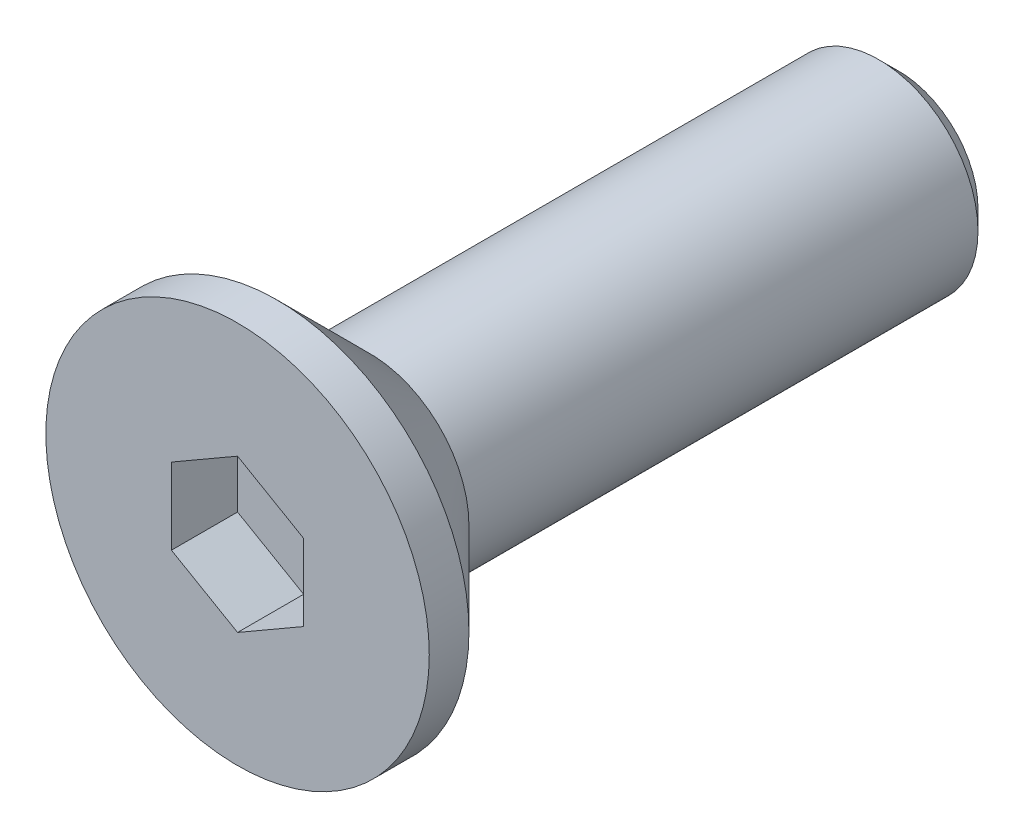
ISO-10303-21;
HEADER;
FILE_DESCRIPTION(('STEP AP214'),'2;1');
FILE_NAME('part.step','',(''),(''),'','','');
FILE_SCHEMA(('AUTOMOTIVE_DESIGN { 1 0 10303 214 1 1 1 1 }'));
ENDSEC;
DATA;
#1=APPLICATION_CONTEXT('core data for automotive mechanical design processes');
#2=APPLICATION_PROTOCOL_DEFINITION('international standard','automotive_design',2000,#1);
#3=PRODUCT_CONTEXT('',#1,'mechanical');
#4=PRODUCT('Part','Part','',(#3));
#5=PRODUCT_RELATED_PRODUCT_CATEGORY('part','',(#4));
#6=PRODUCT_DEFINITION_FORMATION('','',#4);
#7=PRODUCT_DEFINITION_CONTEXT('part definition',#1,'design');
#8=PRODUCT_DEFINITION('design','',#6,#7);
#9=PRODUCT_DEFINITION_SHAPE('','',#8);
#10=(LENGTH_UNIT() NAMED_UNIT(*) SI_UNIT(.MILLI.,.METRE.));
#11=(NAMED_UNIT(*) PLANE_ANGLE_UNIT() SI_UNIT($,.RADIAN.));
#12=(NAMED_UNIT(*) SI_UNIT($,.STERADIAN.) SOLID_ANGLE_UNIT());
#13=UNCERTAINTY_MEASURE_WITH_UNIT(LENGTH_MEASURE(1.E-05),#10,'distance_accuracy_value','');
#14=(GEOMETRIC_REPRESENTATION_CONTEXT(3) GLOBAL_UNCERTAINTY_ASSIGNED_CONTEXT((#13)) GLOBAL_UNIT_ASSIGNED_CONTEXT((#10,
#11,#12)) REPRESENTATION_CONTEXT('',''));
#15=CARTESIAN_POINT('',(0.,0.,0.));
#16=DIRECTION('',(0.,0.,1.));
#17=DIRECTION('',(1.,0.,0.));
#18=AXIS2_PLACEMENT_3D('',#15,#16,#17);
#19=CARTESIAN_POINT('',(0.,0.,0.));
#20=DIRECTION('',(0.,0.,-1.));
#21=DIRECTION('',(-1.,0.,0.));
#22=AXIS2_PLACEMENT_3D('',#19,#20,#21);
#23=PLANE('',#22);
#24=DIRECTION('',(0.,1.,0.));
#25=VECTOR('',#24,1.);
#26=CARTESIAN_POINT('',(1.,-0.577350269189626,0.));
#27=LINE('',#26,#25);
#28=CARTESIAN_POINT('',(1.,-0.577350269189626,0.));
#29=VERTEX_POINT('',#28);
#30=CARTESIAN_POINT('',(1.,0.577350269189626,0.));
#31=VERTEX_POINT('',#30);
#32=EDGE_CURVE('E126',#29,#31,#27,.T.);
#33=ORIENTED_EDGE('',*,*,#32,.F.);
#34=DIRECTION('',(0.866025403784439,0.5,0.));
#35=VECTOR('',#34,1.);
#36=CARTESIAN_POINT('',(0.,-1.15470053837925,0.));
#37=LINE('',#36,#35);
#38=CARTESIAN_POINT('',(0.,-1.15470053837925,0.));
#39=VERTEX_POINT('',#38);
#40=EDGE_CURVE('E52',#39,#29,#37,.T.);
#41=ORIENTED_EDGE('',*,*,#40,.F.);
#42=DIRECTION('',(0.866025403784439,-0.5,0.));
#43=VECTOR('',#42,1.);
#44=CARTESIAN_POINT('',(-1.,-0.577350269189626,0.));
#45=LINE('',#44,#43);
#46=CARTESIAN_POINT('',(-1.,-0.577350269189626,0.));
#47=VERTEX_POINT('',#46);
#48=EDGE_CURVE('E135',#47,#39,#45,.T.);
#49=ORIENTED_EDGE('',*,*,#48,.F.);
#50=DIRECTION('',(0.,-1.,0.));
#51=VECTOR('',#50,1.);
#52=CARTESIAN_POINT('',(-1.,0.577350269189626,0.));
#53=LINE('',#52,#51);
#54=CARTESIAN_POINT('',(-1.,0.577350269189626,0.));
#55=VERTEX_POINT('',#54);
#56=EDGE_CURVE('E133',#55,#47,#53,.T.);
#57=ORIENTED_EDGE('',*,*,#56,.F.);
#58=DIRECTION('',(-0.866025403784439,-0.5,0.));
#59=VECTOR('',#58,1.);
#60=CARTESIAN_POINT('',(0.,1.15470053837925,0.));
#61=LINE('',#60,#59);
#62=CARTESIAN_POINT('',(0.,1.15470053837925,0.));
#63=VERTEX_POINT('',#62);
#64=EDGE_CURVE('E100',#63,#55,#61,.T.);
#65=ORIENTED_EDGE('',*,*,#64,.F.);
#66=DIRECTION('',(-0.866025403784439,0.5,0.));
#67=VECTOR('',#66,1.);
#68=CARTESIAN_POINT('',(1.,0.577350269189626,0.));
#69=LINE('',#68,#67);
#70=EDGE_CURVE('E129',#31,#63,#69,.T.);
#71=ORIENTED_EDGE('',*,*,#70,.F.);
#72=EDGE_LOOP('',(#33,#41,#49,#57,#65,#71));
#73=FACE_BOUND('',#72,.T.);
#74=CARTESIAN_POINT('',(0.,0.,0.));
#75=DIRECTION('',(0.,0.,1.));
#76=DIRECTION('',(1.,0.,0.));
#77=AXIS2_PLACEMENT_3D('',#74,#75,#76);
#78=CIRCLE('',#77,2.9);
#79=CARTESIAN_POINT('',(2.9,0.,0.));
#80=VERTEX_POINT('',#79);
#81=EDGE_CURVE('E150',#80,#80,#78,.T.);
#82=ORIENTED_EDGE('',*,*,#81,.T.);
#83=EDGE_LOOP('',(#82));
#84=FACE_BOUND('',#83,.T.);
#85=ADVANCED_FACE('F37',(#73,#84),#23,.F.);
#86=CARTESIAN_POINT('',(0.,0.,31.7635815070186));
#87=DIRECTION('',(0.,0.,1.));
#88=DIRECTION('',(1.,0.,0.));
#89=AXIS2_PLACEMENT_3D('',#86,#87,#88);
#90=CYLINDRICAL_SURFACE('',#89,2.9);
#91=ORIENTED_EDGE('',*,*,#81,.F.);
#92=EDGE_LOOP('',(#91));
#93=FACE_BOUND('',#92,.T.);
#94=CARTESIAN_POINT('',(0.,0.,-0.60000000000001));
#95=DIRECTION('',(0.,0.,1.));
#96=DIRECTION('',(1.,0.,0.));
#97=AXIS2_PLACEMENT_3D('',#94,#95,#96);
#98=CIRCLE('',#97,2.9);
#99=CARTESIAN_POINT('',(2.9,0.,-0.60000000000001));
#100=VERTEX_POINT('',#99);
#101=EDGE_CURVE('E147',#100,#100,#98,.T.);
#102=ORIENTED_EDGE('',*,*,#101,.T.);
#103=EDGE_LOOP('',(#102));
#104=FACE_BOUND('',#103,.T.);
#105=ADVANCED_FACE('F167',(#93,#104),#90,.T.);
#106=CARTESIAN_POINT('',(0.,0.,-2.));
#107=DIRECTION('',(0.,0.,1.));
#108=DIRECTION('',(1.,0.,0.));
#109=AXIS2_PLACEMENT_3D('',#106,#107,#108);
#110=CONICAL_SURFACE('',#109,1.5,0.785398163397451);
#111=ORIENTED_EDGE('',*,*,#101,.F.);
#112=EDGE_LOOP('',(#111));
#113=FACE_BOUND('',#112,.T.);
#114=CARTESIAN_POINT('',(0.,0.,-2.));
#115=DIRECTION('',(0.,0.,1.));
#116=DIRECTION('',(1.,0.,0.));
#117=AXIS2_PLACEMENT_3D('',#114,#115,#116);
#118=CIRCLE('',#117,1.5);
#119=CARTESIAN_POINT('',(1.5,0.,-2.));
#120=VERTEX_POINT('',#119);
#121=EDGE_CURVE('E139',#120,#120,#118,.T.);
#122=ORIENTED_EDGE('',*,*,#121,.T.);
#123=EDGE_LOOP('',(#122));
#124=FACE_BOUND('',#123,.T.);
#125=ADVANCED_FACE('F172',(#113,#124),#110,.T.);
#126=CARTESIAN_POINT('',(0.,0.,31.7635815070186));
#127=DIRECTION('',(0.,0.,1.));
#128=DIRECTION('',(1.,0.,0.));
#129=AXIS2_PLACEMENT_3D('',#126,#127,#128);
#130=CYLINDRICAL_SURFACE('',#129,1.5);
#131=CARTESIAN_POINT('',(0.,0.,-9.7));
#132=DIRECTION('',(0.,0.,1.));
#133=DIRECTION('',(1.,0.,0.));
#134=AXIS2_PLACEMENT_3D('',#131,#132,#133);
#135=CIRCLE('',#134,1.5);
#136=CARTESIAN_POINT('',(1.5,0.,-9.7));
#137=VERTEX_POINT('',#136);
#138=EDGE_CURVE('E45',#137,#137,#135,.T.);
#139=ORIENTED_EDGE('',*,*,#138,.T.);
#140=EDGE_LOOP('',(#139));
#141=FACE_BOUND('',#140,.T.);
#142=ORIENTED_EDGE('',*,*,#121,.F.);
#143=EDGE_LOOP('',(#142));
#144=FACE_BOUND('',#143,.T.);
#145=ADVANCED_FACE('F155',(#141,#144),#130,.T.);
#146=CARTESIAN_POINT('',(0.,1.5,-10.));
#147=DIRECTION('',(0.,0.,1.));
#148=DIRECTION('',(1.,0.,0.));
#149=AXIS2_PLACEMENT_3D('',#146,#147,#148);
#150=PLANE('',#149);
#151=CARTESIAN_POINT('',(0.,0.,-10.));
#152=DIRECTION('',(0.,0.,1.));
#153=DIRECTION('',(1.,0.,0.));
#154=AXIS2_PLACEMENT_3D('',#151,#152,#153);
#155=CIRCLE('',#154,1.19999999999999);
#156=CARTESIAN_POINT('',(1.19999999999999,0.,-10.));
#157=VERTEX_POINT('',#156);
#158=EDGE_CURVE('E11',#157,#157,#155,.F.);
#159=ORIENTED_EDGE('',*,*,#158,.T.);
#160=EDGE_LOOP('',(#159));
#161=FACE_BOUND('',#160,.T.);
#162=ADVANCED_FACE('F183',(#161),#150,.F.);
#163=CARTESIAN_POINT('',(0.,-1.15470053837925,-1.));
#164=DIRECTION('',(0.5,-0.866025403784439,0.));
#165=DIRECTION('',(0.866025403784439,0.5,0.));
#166=AXIS2_PLACEMENT_3D('',#163,#164,#165);
#167=PLANE('',#166);
#168=ORIENTED_EDGE('',*,*,#40,.T.);
#169=DIRECTION('',(0.,0.,1.));
#170=VECTOR('',#169,1.);
#171=CARTESIAN_POINT('',(1.,-0.577350269189626,-1.));
#172=LINE('',#171,#170);
#173=CARTESIAN_POINT('',(1.,-0.577350269189626,-1.));
#174=VERTEX_POINT('',#173);
#175=EDGE_CURVE('E82',#174,#29,#172,.T.);
#176=ORIENTED_EDGE('',*,*,#175,.F.);
#177=DIRECTION('',(0.866025403784439,0.5,0.));
#178=VECTOR('',#177,1.);
#179=CARTESIAN_POINT('',(0.,-1.15470053837925,-1.));
#180=LINE('',#179,#178);
#181=CARTESIAN_POINT('',(0.,-1.15470053837925,-1.));
#182=VERTEX_POINT('',#181);
#183=EDGE_CURVE('E137',#182,#174,#180,.T.);
#184=ORIENTED_EDGE('',*,*,#183,.F.);
#185=DIRECTION('',(0.,0.,1.));
#186=VECTOR('',#185,1.);
#187=CARTESIAN_POINT('',(0.,-1.15470053837925,-1.));
#188=LINE('',#187,#186);
#189=EDGE_CURVE('E60',#182,#39,#188,.T.);
#190=ORIENTED_EDGE('',*,*,#189,.T.);
#191=EDGE_LOOP('',(#168,#176,#184,#190));
#192=FACE_BOUND('',#191,.T.);
#193=ADVANCED_FACE('F186',(#192),#167,.F.);
#194=CARTESIAN_POINT('',(-1.,-0.577350269189626,-1.));
#195=DIRECTION('',(-0.5,-0.866025403784439,0.));
#196=DIRECTION('',(0.866025403784439,-0.5,0.));
#197=AXIS2_PLACEMENT_3D('',#194,#195,#196);
#198=PLANE('',#197);
#199=ORIENTED_EDGE('',*,*,#48,.T.);
#200=ORIENTED_EDGE('',*,*,#189,.F.);
#201=DIRECTION('',(0.866025403784439,-0.5,0.));
#202=VECTOR('',#201,1.);
#203=CARTESIAN_POINT('',(-1.,-0.577350269189626,-1.));
#204=LINE('',#203,#202);
#205=CARTESIAN_POINT('',(-1.,-0.577350269189626,-1.));
#206=VERTEX_POINT('',#205);
#207=EDGE_CURVE('E112',#206,#182,#204,.T.);
#208=ORIENTED_EDGE('',*,*,#207,.F.);
#209=DIRECTION('',(0.,0.,1.));
#210=VECTOR('',#209,1.);
#211=CARTESIAN_POINT('',(-1.,-0.577350269189626,-1.));
#212=LINE('',#211,#210);
#213=EDGE_CURVE('E104',#206,#47,#212,.T.);
#214=ORIENTED_EDGE('',*,*,#213,.T.);
#215=EDGE_LOOP('',(#199,#200,#208,#214));
#216=FACE_BOUND('',#215,.T.);
#217=ADVANCED_FACE('F190',(#216),#198,.F.);
#218=CARTESIAN_POINT('',(-1.,0.577350269189626,-1.));
#219=DIRECTION('',(-1.,0.,0.));
#220=DIRECTION('',(0.,-1.,0.));
#221=AXIS2_PLACEMENT_3D('',#218,#219,#220);
#222=PLANE('',#221);
#223=ORIENTED_EDGE('',*,*,#56,.T.);
#224=ORIENTED_EDGE('',*,*,#213,.F.);
#225=DIRECTION('',(0.,-1.,0.));
#226=VECTOR('',#225,1.);
#227=CARTESIAN_POINT('',(-1.,0.577350269189626,-1.));
#228=LINE('',#227,#226);
#229=CARTESIAN_POINT('',(-1.,0.577350269189626,-1.));
#230=VERTEX_POINT('',#229);
#231=EDGE_CURVE('E108',#230,#206,#228,.T.);
#232=ORIENTED_EDGE('',*,*,#231,.F.);
#233=DIRECTION('',(0.,0.,1.));
#234=VECTOR('',#233,1.);
#235=CARTESIAN_POINT('',(-1.,0.577350269189626,-1.));
#236=LINE('',#235,#234);
#237=EDGE_CURVE('E93',#230,#55,#236,.T.);
#238=ORIENTED_EDGE('',*,*,#237,.T.);
#239=EDGE_LOOP('',(#223,#224,#232,#238));
#240=FACE_BOUND('',#239,.T.);
#241=ADVANCED_FACE('F109',(#240),#222,.F.);
#242=CARTESIAN_POINT('',(0.,1.15470053837925,-1.));
#243=DIRECTION('',(-0.5,0.866025403784439,0.));
#244=DIRECTION('',(-0.866025403784439,-0.5,0.));
#245=AXIS2_PLACEMENT_3D('',#242,#243,#244);
#246=PLANE('',#245);
#247=ORIENTED_EDGE('',*,*,#64,.T.);
#248=ORIENTED_EDGE('',*,*,#237,.F.);
#249=DIRECTION('',(-0.866025403784439,-0.5,0.));
#250=VECTOR('',#249,1.);
#251=CARTESIAN_POINT('',(0.,1.15470053837925,-1.));
#252=LINE('',#251,#250);
#253=CARTESIAN_POINT('',(0.,1.15470053837925,-1.));
#254=VERTEX_POINT('',#253);
#255=EDGE_CURVE('E97',#254,#230,#252,.T.);
#256=ORIENTED_EDGE('',*,*,#255,.F.);
#257=DIRECTION('',(0.,0.,1.));
#258=VECTOR('',#257,1.);
#259=CARTESIAN_POINT('',(0.,1.15470053837925,-1.));
#260=LINE('',#259,#258);
#261=EDGE_CURVE('E105',#254,#63,#260,.T.);
#262=ORIENTED_EDGE('',*,*,#261,.T.);
#263=EDGE_LOOP('',(#247,#248,#256,#262));
#264=FACE_BOUND('',#263,.T.);
#265=ADVANCED_FACE('F95',(#264),#246,.F.);
#266=CARTESIAN_POINT('',(1.,0.577350269189626,-1.));
#267=DIRECTION('',(0.5,0.866025403784439,0.));
#268=DIRECTION('',(-0.866025403784439,0.5,0.));
#269=AXIS2_PLACEMENT_3D('',#266,#267,#268);
#270=PLANE('',#269);
#271=ORIENTED_EDGE('',*,*,#70,.T.);
#272=ORIENTED_EDGE('',*,*,#261,.F.);
#273=DIRECTION('',(-0.866025403784439,0.5,0.));
#274=VECTOR('',#273,1.);
#275=CARTESIAN_POINT('',(1.,0.577350269189626,-1.));
#276=LINE('',#275,#274);
#277=CARTESIAN_POINT('',(1.,0.577350269189626,-1.));
#278=VERTEX_POINT('',#277);
#279=EDGE_CURVE('E118',#278,#254,#276,.T.);
#280=ORIENTED_EDGE('',*,*,#279,.F.);
#281=DIRECTION('',(0.,0.,1.));
#282=VECTOR('',#281,1.);
#283=CARTESIAN_POINT('',(1.,0.577350269189626,-1.));
#284=LINE('',#283,#282);
#285=EDGE_CURVE('E142',#278,#31,#284,.T.);
#286=ORIENTED_EDGE('',*,*,#285,.T.);
#287=EDGE_LOOP('',(#271,#272,#280,#286));
#288=FACE_BOUND('',#287,.T.);
#289=ADVANCED_FACE('F193',(#288),#270,.F.);
#290=CARTESIAN_POINT('',(1.,-0.577350269189626,-1.));
#291=DIRECTION('',(1.,0.,0.));
#292=DIRECTION('',(0.,1.,0.));
#293=AXIS2_PLACEMENT_3D('',#290,#291,#292);
#294=PLANE('',#293);
#295=ORIENTED_EDGE('',*,*,#32,.T.);
#296=ORIENTED_EDGE('',*,*,#285,.F.);
#297=DIRECTION('',(0.,1.,0.));
#298=VECTOR('',#297,1.);
#299=CARTESIAN_POINT('',(1.,-0.577350269189626,-1.));
#300=LINE('',#299,#298);
#301=EDGE_CURVE('E120',#174,#278,#300,.T.);
#302=ORIENTED_EDGE('',*,*,#301,.F.);
#303=ORIENTED_EDGE('',*,*,#175,.T.);
#304=EDGE_LOOP('',(#295,#296,#302,#303));
#305=FACE_BOUND('',#304,.T.);
#306=ADVANCED_FACE('F163',(#305),#294,.F.);
#307=CARTESIAN_POINT('',(0.,0.,-1.));
#308=DIRECTION('',(0.,0.,1.));
#309=DIRECTION('',(1.,0.,0.));
#310=AXIS2_PLACEMENT_3D('',#307,#308,#309);
#311=PLANE('',#310);
#312=ORIENTED_EDGE('',*,*,#183,.T.);
#313=ORIENTED_EDGE('',*,*,#301,.T.);
#314=ORIENTED_EDGE('',*,*,#279,.T.);
#315=ORIENTED_EDGE('',*,*,#255,.T.);
#316=ORIENTED_EDGE('',*,*,#231,.T.);
#317=ORIENTED_EDGE('',*,*,#207,.T.);
#318=EDGE_LOOP('',(#312,#313,#314,#315,#316,#317));
#319=FACE_BOUND('',#318,.T.);
#320=ADVANCED_FACE('F115',(#319),#311,.T.);
#321=CARTESIAN_POINT('',(0.,0.,-9.7));
#322=DIRECTION('',(0.,0.,1.));
#323=DIRECTION('',(1.,0.,0.));
#324=AXIS2_PLACEMENT_3D('',#321,#322,#323);
#325=CONICAL_SURFACE('',#324,1.5,0.785398163397453);
#326=ORIENTED_EDGE('',*,*,#158,.F.);
#327=EDGE_LOOP('',(#326));
#328=FACE_BOUND('',#327,.T.);
#329=ORIENTED_EDGE('',*,*,#138,.F.);
#330=EDGE_LOOP('',(#329));
#331=FACE_BOUND('',#330,.T.);
#332=ADVANCED_FACE('F39',(#328,#331),#325,.T.);
#333=CLOSED_SHELL('',(#85,#105,#125,#145,#162,#193,#217,#241,#265,#289,#306,#320,#332));
#334=MANIFOLD_SOLID_BREP('B2',#333);
#335=ADVANCED_BREP_SHAPE_REPRESENTATION('',(#18,#334),#14);
#336=SHAPE_DEFINITION_REPRESENTATION(#9,#335);
ENDSEC;
END-ISO-10303-21;
